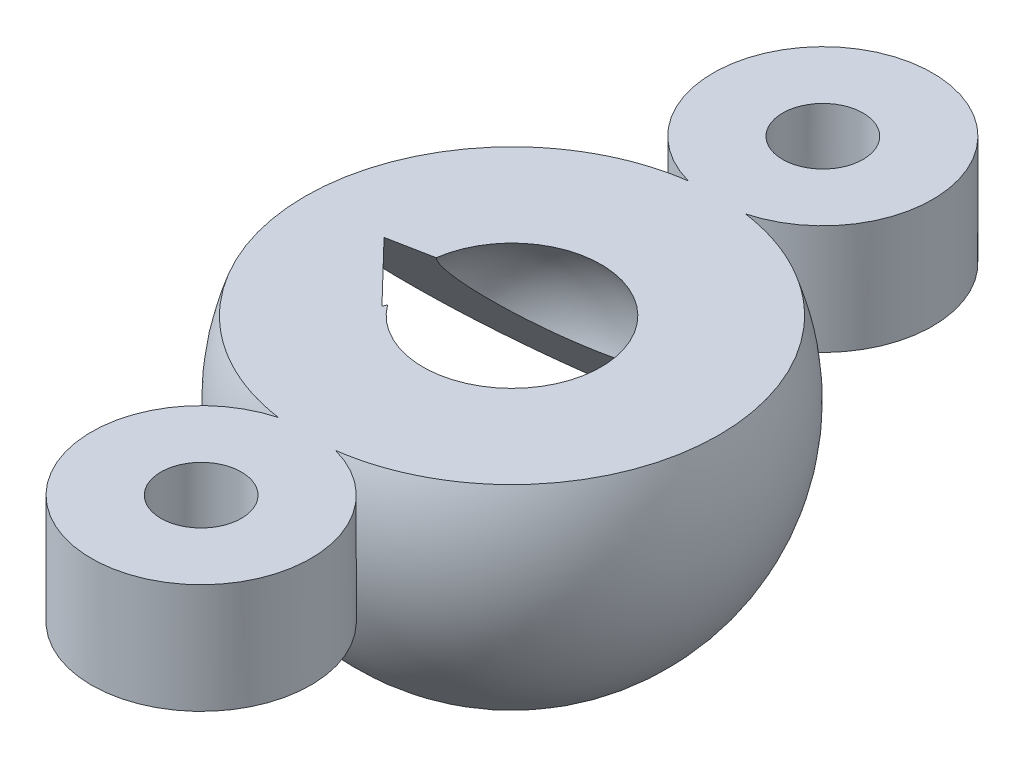
ISO-10303-21;
HEADER;
FILE_DESCRIPTION(('STEP AP214'),'2;1');
FILE_NAME('part.step','',(''),(''),'','','');
FILE_SCHEMA(('AUTOMOTIVE_DESIGN { 1 0 10303 214 1 1 1 1 }'));
ENDSEC;
DATA;
#1=APPLICATION_CONTEXT('core data for automotive mechanical design processes');
#2=APPLICATION_PROTOCOL_DEFINITION('international standard','automotive_design',2000,#1);
#3=PRODUCT_CONTEXT('',#1,'mechanical');
#4=PRODUCT('Part','Part','',(#3));
#5=PRODUCT_RELATED_PRODUCT_CATEGORY('part','',(#4));
#6=PRODUCT_DEFINITION_FORMATION('','',#4);
#7=PRODUCT_DEFINITION_CONTEXT('part definition',#1,'design');
#8=PRODUCT_DEFINITION('design','',#6,#7);
#9=PRODUCT_DEFINITION_SHAPE('','',#8);
#10=(LENGTH_UNIT() NAMED_UNIT(*) SI_UNIT(.MILLI.,.METRE.));
#11=(NAMED_UNIT(*) PLANE_ANGLE_UNIT() SI_UNIT($,.RADIAN.));
#12=(NAMED_UNIT(*) SI_UNIT($,.STERADIAN.) SOLID_ANGLE_UNIT());
#13=UNCERTAINTY_MEASURE_WITH_UNIT(LENGTH_MEASURE(1.E-05),#10,'distance_accuracy_value','');
#14=(GEOMETRIC_REPRESENTATION_CONTEXT(3) GLOBAL_UNCERTAINTY_ASSIGNED_CONTEXT((#13)) GLOBAL_UNIT_ASSIGNED_CONTEXT((#10,
#11,#12)) REPRESENTATION_CONTEXT('',''));
#15=CARTESIAN_POINT('',(0.,0.,0.));
#16=DIRECTION('',(0.,0.,1.));
#17=DIRECTION('',(1.,0.,0.));
#18=AXIS2_PLACEMENT_3D('',#15,#16,#17);
#19=CARTESIAN_POINT('',(-26.2916512459885,-73.,0.));
#20=DIRECTION('',(0.,0.,-1.));
#21=DIRECTION('',(-1.,0.,0.));
#22=AXIS2_PLACEMENT_3D('',#19,#20,#21);
#23=SPHERICAL_SURFACE('',#22,6.);
#24=CARTESIAN_POINT('',(-26.2916512459885,-71.,0.));
#25=DIRECTION('',(0.,1.,0.));
#26=DIRECTION('',(0.,0.,1.));
#27=AXIS2_PLACEMENT_3D('',#24,#25,#26);
#28=CIRCLE('',#27,5.65685424949238);
#29=CARTESIAN_POINT('',(-25.5125170001679,-71.,-5.60294117647059));
#30=VERTEX_POINT('',#29);
#31=CARTESIAN_POINT('',(-25.5125170001679,-71.,5.60294117647059));
#32=VERTEX_POINT('',#31);
#33=EDGE_CURVE('E241',#30,#32,#28,.F.);
#34=ORIENTED_EDGE('',*,*,#33,.T.);
#35=CARTESIAN_POINT('',(-25.512692009056,-70.9998,5.60289411529412));
#36=CARTESIAN_POINT('',(-25.4881300650007,-71.0278724460279,5.60950105457931));
#37=CARTESIAN_POINT('',(-25.4645799480684,-71.0567865660779,5.61616491159099));
#38=CARTESIAN_POINT('',(-25.4194041658645,-71.1160434934821,5.62950480182121));
#39=CARTESIAN_POINT('',(-25.3977769695417,-71.1463851342512,5.63618082095439));
#40=CARTESIAN_POINT('',(-25.3357390662621,-71.238994388675,5.65603840498483));
#41=CARTESIAN_POINT('',(-25.2979793181203,-71.303072510316,5.66910337854202));
#42=CARTESIAN_POINT('',(-25.229123634781,-71.4339893832936,5.69422706830234));
#43=CARTESIAN_POINT('',(-25.1979643450552,-71.5007937830541,5.70629460260237));
#44=CARTESIAN_POINT('',(-25.1411154943275,-71.6369688871939,5.72922297039156));
#45=CARTESIAN_POINT('',(-25.1154326977698,-71.7063426425279,5.74008230371415));
#46=CARTESIAN_POINT('',(-25.0618534813116,-71.8687142272823,5.76345066197582));
#47=CARTESIAN_POINT('',(-25.0357348493299,-71.9623745047603,5.77542903147855));
#48=CARTESIAN_POINT('',(-24.9911039620327,-72.1518627703867,5.79645035012798));
#49=CARTESIAN_POINT('',(-24.9725980638522,-72.2476925000107,5.80549084463764));
#50=CARTESIAN_POINT('',(-24.9425054025653,-72.4413341169983,5.82043119119931));
#51=CARTESIAN_POINT('',(-24.9309664449169,-72.5391550423461,5.82630931453206));
#52=CARTESIAN_POINT('',(-24.9146337564057,-72.7354433347071,5.83468458220686));
#53=CARTESIAN_POINT('',(-24.9098363815657,-72.8339103235676,5.83718355302931));
#54=CARTESIAN_POINT('',(-24.9069455687282,-73.0229211548644,5.83868607168889));
#55=CARTESIAN_POINT('',(-24.9083367836104,-73.1134555342483,5.83795833659046));
#56=CARTESIAN_POINT('',(-24.916709654596,-73.2941775183516,5.83362505478977));
#57=CARTESIAN_POINT('',(-24.9236899862422,-73.3843652001411,5.83002018988385));
#58=CARTESIAN_POINT('',(-24.9433049941966,-73.5629332316181,5.82005707797701));
#59=CARTESIAN_POINT('',(-24.955874113767,-73.6513224558663,5.81373078071612));
#60=CARTESIAN_POINT('',(-24.9870347069322,-73.8268475917443,5.79847549481539));
#61=CARTESIAN_POINT('',(-25.0056292770649,-73.9139828348421,5.78954516817626));
#62=CARTESIAN_POINT('',(-25.0274235715006,-74.0002,5.77938823294117));
#63=B_SPLINE_CURVE_WITH_KNOTS('',3,(#35,#36,#37,#38,#39,#40,#41,#42,#43,#44,#45,#46,#47,#48,#49,
#50,#51,#52,#53,#54,#55,#56,#57,#58,#59,#60,#61,#62),.UNSPECIFIED.,.F.,.F.,(4,2,2,2,2,2,2,2,2,2,
2,2,2,4),(0.,0.113585797209034,0.227080330731854,0.453169231822953,0.676978393535298,
0.901062418299851,1.19454534747401,1.48827285917147,1.78399360635949,2.07955444826479,
2.35098507155556,2.62235139274868,2.89061526718664,3.15901722427241),.UNSPECIFIED.);
#64=CARTESIAN_POINT('',(-25.0273729324914,-74.,5.77941176470588));
#65=VERTEX_POINT('',#64);
#66=EDGE_CURVE('E199',#32,#65,#63,.T.);
#67=ORIENTED_EDGE('',*,*,#66,.T.);
#68=CARTESIAN_POINT('',(-26.2916512459885,-74.,0.));
#69=DIRECTION('',(0.,-1.,0.));
#70=DIRECTION('',(0.,0.,-1.));
#71=AXIS2_PLACEMENT_3D('',#68,#69,#70);
#72=CIRCLE('',#71,5.91607978309961);
#73=CARTESIAN_POINT('',(-27.5559295594857,-74.,5.77941176470588));
#74=VERTEX_POINT('',#73);
#75=EDGE_CURVE('E246',#74,#65,#72,.F.);
#76=ORIENTED_EDGE('',*,*,#75,.F.);
#77=CARTESIAN_POINT('',(-27.5558789204764,-74.0002,5.77938823294117));
#78=CARTESIAN_POINT('',(-27.5686720218173,-73.9496620404665,5.78533603706417));
#79=CARTESIAN_POINT('',(-27.5803493209923,-73.8988041487702,5.79086867899217));
#80=CARTESIAN_POINT('',(-27.6015697054814,-73.7965686087353,5.80106400383362));
#81=CARTESIAN_POINT('',(-27.6111132167292,-73.7451910662703,5.80572686033751));
#82=CARTESIAN_POINT('',(-27.6366863405981,-73.5904873630535,5.81834985115131));
#83=CARTESIAN_POINT('',(-27.6496728986549,-73.4865322631475,5.82495127439358));
#84=CARTESIAN_POINT('',(-27.6681832151123,-73.2757451332539,5.83442924526646));
#85=CARTESIAN_POINT('',(-27.6735549053866,-73.1688967733631,5.83722984539448));
#86=CARTESIAN_POINT('',(-27.676555124043,-72.9550449188531,5.83878893274145));
#87=CARTESIAN_POINT('',(-27.674182588232,-72.8480414049326,5.83754686442657));
#88=CARTESIAN_POINT('',(-27.661616303271,-72.6348501805666,5.83105898688946));
#89=CARTESIAN_POINT('',(-27.6514399142857,-72.52866118703,5.82582206460827));
#90=CARTESIAN_POINT('',(-27.6229042752232,-72.3176550384306,5.81150186953819));
#91=CARTESIAN_POINT('',(-27.6045464824233,-72.2128376424789,5.80241928175627));
#92=CARTESIAN_POINT('',(-27.5591687490317,-72.0065978326292,5.78080399137251));
#93=CARTESIAN_POINT('',(-27.5322421988807,-71.9051512731432,5.76830868290863));
#94=CARTESIAN_POINT('',(-27.468626396254,-71.7058549967528,5.74030040521022));
#95=CARTESIAN_POINT('',(-27.4319457780831,-71.6080021854262,5.72479010809538));
#96=CARTESIAN_POINT('',(-27.3485901487389,-71.4206435124871,5.69200590870795));
#97=CARTESIAN_POINT('',(-27.3022726465904,-71.3309707282417,5.6748043528184));
#98=CARTESIAN_POINT('',(-27.2232683117044,-71.2020077467897,5.64818243977232));
#99=CARTESIAN_POINT('',(-27.1952182950292,-71.1597920463394,5.63913526501787));
#100=CARTESIAN_POINT('',(-27.1356124751682,-71.0778030739369,5.62099148786998));
#101=CARTESIAN_POINT('',(-27.1040499036828,-71.0380347549416,5.61189482333462));
#102=CARTESIAN_POINT('',(-27.0706104829247,-70.9997999999984,5.60289411529386));
#103=B_SPLINE_CURVE_WITH_KNOTS('',3,(#77,#78,#79,#80,#81,#82,#83,#84,#85,#86,#87,#88,#89,#90,
#91,#92,#93,#94,#95,#96,#97,#98,#99,#100,#101,#102),.UNSPECIFIED.,.F.,.F.,(4,2,2,2,2,2,2,2,2,2,
2,2,4),(0.,0.157377048485897,0.314722654217878,0.629234458382304,0.949942579700638,
1.27069477382298,1.59073549691188,1.91071923689571,2.2273285093036,2.54365844666375,
2.84986255835421,3.00416307873593,3.15876624238536),.UNSPECIFIED.);
#104=CARTESIAN_POINT('',(-27.0707854918091,-71.,5.60294117647059));
#105=VERTEX_POINT('',#104);
#106=EDGE_CURVE('E188',#74,#105,#103,.T.);
#107=ORIENTED_EDGE('',*,*,#106,.T.);
#108=CARTESIAN_POINT('',(-27.0707854918091,-71.,-5.60294117647059));
#109=VERTEX_POINT('',#108);
#110=EDGE_CURVE('E239',#105,#109,#28,.F.);
#111=ORIENTED_EDGE('',*,*,#110,.T.);
#112=CARTESIAN_POINT('',(-27.0706104829211,-70.9998,-5.60289411529412));
#113=CARTESIAN_POINT('',(-27.0951724269763,-71.0278724460279,-5.60950105457931));
#114=CARTESIAN_POINT('',(-27.1187225439086,-71.0567865660779,-5.61616491159099));
#115=CARTESIAN_POINT('',(-27.1638983261125,-71.1160434934821,-5.62950480182121));
#116=CARTESIAN_POINT('',(-27.1855255224353,-71.1463851342512,-5.63618082095439));
#117=CARTESIAN_POINT('',(-27.2475634257149,-71.238994388675,-5.65603840498483));
#118=CARTESIAN_POINT('',(-27.2853231738568,-71.303072510316,-5.66910337854202));
#119=CARTESIAN_POINT('',(-27.354178857196,-71.4339893832936,-5.69422706830234));
#120=CARTESIAN_POINT('',(-27.3853381469219,-71.5007937830541,-5.70629460260237));
#121=CARTESIAN_POINT('',(-27.4421869976495,-71.6369688871939,-5.72922297039156));
#122=CARTESIAN_POINT('',(-27.4678697942072,-71.7063426425279,-5.74008230371415));
#123=CARTESIAN_POINT('',(-27.5214490106654,-71.8687142272823,-5.76345066197582));
#124=CARTESIAN_POINT('',(-27.5475676426472,-71.9623745047603,-5.77542903147855));
#125=CARTESIAN_POINT('',(-27.5921985299443,-72.1518627703867,-5.79645035012798));
#126=CARTESIAN_POINT('',(-27.6107044281248,-72.2476925000107,-5.80549084463764));
#127=CARTESIAN_POINT('',(-27.6407970894118,-72.4413341169983,-5.82043119119931));
#128=CARTESIAN_POINT('',(-27.6523360470602,-72.5391550423461,-5.82630931453206));
#129=CARTESIAN_POINT('',(-27.6686687355714,-72.7354433347071,-5.83468458220686));
#130=CARTESIAN_POINT('',(-27.6734661104114,-72.8339103235676,-5.83718355302931));
#131=CARTESIAN_POINT('',(-27.6763569232488,-73.0229211548644,-5.83868607168889));
#132=CARTESIAN_POINT('',(-27.6749657083667,-73.1134555342483,-5.83795833659046));
#133=CARTESIAN_POINT('',(-27.666592837381,-73.2941775183516,-5.83362505478977));
#134=CARTESIAN_POINT('',(-27.6596125057349,-73.3843652001411,-5.83002018988385));
#135=CARTESIAN_POINT('',(-27.6399974977805,-73.5629332316181,-5.82005707797701));
#136=CARTESIAN_POINT('',(-27.6274283782101,-73.6513224558663,-5.81373078071612));
#137=CARTESIAN_POINT('',(-27.5962677850448,-73.8268475917443,-5.79847549481539));
#138=CARTESIAN_POINT('',(-27.5776732149121,-73.9139828348421,-5.78954516817626));
#139=CARTESIAN_POINT('',(-27.5558789204764,-74.0002,-5.77938823294117));
#140=B_SPLINE_CURVE_WITH_KNOTS('',3,(#112,#113,#114,#115,#116,#117,#118,#119,#120,#121,#122,
#123,#124,#125,#126,#127,#128,#129,#130,#131,#132,#133,#134,#135,#136,#137,#138,#139),
.UNSPECIFIED.,.F.,.F.,(4,2,2,2,2,2,2,2,2,2,2,2,2,4),(0.,0.113585797209034,0.227080330731854,
0.453169231822953,0.676978393535298,0.901062418299851,1.19454534747401,1.48827285917147,
1.78399360635949,2.07955444826479,2.35098507155556,2.62235139274868,2.89061526718664,
3.15901722427241),.UNSPECIFIED.);
#141=CARTESIAN_POINT('',(-27.5559295594857,-74.,-5.77941176470588));
#142=VERTEX_POINT('',#141);
#143=EDGE_CURVE('E234',#109,#142,#140,.T.);
#144=ORIENTED_EDGE('',*,*,#143,.T.);
#145=CARTESIAN_POINT('',(-26.2916512459885,-74.,0.));
#146=DIRECTION('',(0.,-1.,0.));
#147=DIRECTION('',(0.,0.,-1.));
#148=AXIS2_PLACEMENT_3D('',#145,#146,#147);
#149=CIRCLE('',#148,5.91607978309961);
#150=CARTESIAN_POINT('',(-25.0273729324914,-74.,-5.77941176470588));
#151=VERTEX_POINT('',#150);
#152=EDGE_CURVE('E243',#151,#142,#149,.F.);
#153=ORIENTED_EDGE('',*,*,#152,.F.);
#154=CARTESIAN_POINT('',(-25.0274235715006,-74.0002,-5.77938823294117));
#155=CARTESIAN_POINT('',(-25.0146304701598,-73.9496620404665,-5.78533603706417));
#156=CARTESIAN_POINT('',(-25.0029531709847,-73.8988041487702,-5.79086867899217));
#157=CARTESIAN_POINT('',(-24.9817327864956,-73.7965686087353,-5.80106400383362));
#158=CARTESIAN_POINT('',(-24.9721892752478,-73.7451910662703,-5.80572686033751));
#159=CARTESIAN_POINT('',(-24.946616151379,-73.5904873630535,-5.81834985115131));
#160=CARTESIAN_POINT('',(-24.9336295933221,-73.4865322631475,-5.82495127439358));
#161=CARTESIAN_POINT('',(-24.9151192768648,-73.2757451332539,-5.83442924526646));
#162=CARTESIAN_POINT('',(-24.9097475865905,-73.1688967733631,-5.83722984539448));
#163=CARTESIAN_POINT('',(-24.906747367934,-72.9550449188531,-5.83878893274145));
#164=CARTESIAN_POINT('',(-24.909119903745,-72.8480414049326,-5.83754686442657));
#165=CARTESIAN_POINT('',(-24.921686188706,-72.6348501805666,-5.83105898688946));
#166=CARTESIAN_POINT('',(-24.9318625776913,-72.52866118703,-5.82582206460827));
#167=CARTESIAN_POINT('',(-24.9603982167538,-72.3176550384306,-5.81150186953819));
#168=CARTESIAN_POINT('',(-24.9787560095538,-72.2128376424789,-5.80241928175627));
#169=CARTESIAN_POINT('',(-25.0241337429453,-72.0065978326292,-5.78080399137251));
#170=CARTESIAN_POINT('',(-25.0510602930963,-71.9051512731432,-5.76830868290863));
#171=CARTESIAN_POINT('',(-25.114676095723,-71.7058549967528,-5.74030040521022));
#172=CARTESIAN_POINT('',(-25.151356713894,-71.6080021854262,-5.72479010809538));
#173=CARTESIAN_POINT('',(-25.2347123432382,-71.4206435124871,-5.69200590870795));
#174=CARTESIAN_POINT('',(-25.2810298453866,-71.3309707282417,-5.6748043528184));
#175=CARTESIAN_POINT('',(-25.3600341802726,-71.2020077467897,-5.64818243977232));
#176=CARTESIAN_POINT('',(-25.3880841969479,-71.1597920463394,-5.63913526501787));
#177=CARTESIAN_POINT('',(-25.4476900168088,-71.0778030739369,-5.62099148786998));
#178=CARTESIAN_POINT('',(-25.4792525882942,-71.0380347549416,-5.61189482333462));
#179=CARTESIAN_POINT('',(-25.5126920090523,-70.9997999999984,-5.60289411529386));
#180=B_SPLINE_CURVE_WITH_KNOTS('',3,(#154,#155,#156,#157,#158,#159,#160,#161,#162,#163,#164,
#165,#166,#167,#168,#169,#170,#171,#172,#173,#174,#175,#176,#177,#178,#179),.UNSPECIFIED.,.F.,
.F.,(4,2,2,2,2,2,2,2,2,2,2,2,4),(0.,0.157377048485897,0.314722654217878,0.629234458382304,
0.949942579700638,1.27069477382298,1.59073549691188,1.91071923689571,2.2273285093036,
2.54365844666375,2.84986255835421,3.00416307873593,3.15876624238536),.UNSPECIFIED.);
#181=EDGE_CURVE('E227',#151,#30,#180,.T.);
#182=ORIENTED_EDGE('',*,*,#181,.T.);
#183=EDGE_LOOP('',(#34,#67,#76,#107,#111,#144,#153,#182));
#184=FACE_BOUND('',#183,.T.);
#185=CARTESIAN_POINT('',(-26.5685991890742,-71.7684504931306,-1.42006536784419));
#186=DIRECTION('',(0.145762075308234,-0.648183950983876,0.747402825181153));
#187=DIRECTION('',(0.,-0.755471507146539,-0.655181503012514));
#188=AXIS2_PLACEMENT_3D('',#185,#186,#187);
#189=CIRCLE('',#188,5.69122131005288);
#190=CARTESIAN_POINT('',(-28.3091391382539,-76.0254293010476,-4.77247526435969));
#191=VERTEX_POINT('',#190);
#192=CARTESIAN_POINT('',(-32.1881264123781,-72.5784404179814,-1.02658079611846));
#193=VERTEX_POINT('',#192);
#194=EDGE_CURVE('E135',#191,#193,#189,.F.);
#195=ORIENTED_EDGE('',*,*,#194,.T.);
#196=CARTESIAN_POINT('',(-28.2311448830506,-71.2765055584669,1.87294723412062));
#197=DIRECTION('',(0.606091761581906,-0.538592012979099,-0.585296010662693));
#198=DIRECTION('',(-0.694658370458998,0.,-0.71933980033865));
#199=AXIS2_PLACEMENT_3D('',#196,#197,#198);
#200=CIRCLE('',#199,5.07543101617981);
#201=CARTESIAN_POINT('',(-31.6342305262068,-75.0415394317201,1.81354993956992));
#202=VERTEX_POINT('',#201);
#203=EDGE_CURVE('E170',#193,#202,#200,.F.);
#204=ORIENTED_EDGE('',*,*,#203,.T.);
#205=CARTESIAN_POINT('',(-26.0147033029029,-74.2315495068694,1.4200653678442));
#206=DIRECTION('',(-0.145762075308233,0.648183950983876,-0.747402825181153));
#207=DIRECTION('',(0.,0.755471507146539,0.655181503012514));
#208=AXIS2_PLACEMENT_3D('',#205,#206,#207);
#209=CIRCLE('',#208,5.69122131005288);
#210=CARTESIAN_POINT('',(-27.7552432520826,-78.4885283147863,-1.9323445286713));
#211=VERTEX_POINT('',#210);
#212=EDGE_CURVE('E157',#202,#211,#209,.F.);
#213=ORIENTED_EDGE('',*,*,#212,.T.);
#214=CARTESIAN_POINT('',(-24.3521576089264,-74.7234944415331,-1.87294723412062));
#215=DIRECTION('',(-0.606091761581906,0.538592012979099,0.585296010662693));
#216=DIRECTION('',(0.694658370458998,0.,0.71933980033865));
#217=AXIS2_PLACEMENT_3D('',#214,#215,#216);
#218=CIRCLE('',#217,5.07543101617981);
#219=EDGE_CURVE('E11',#211,#191,#218,.F.);
#220=ORIENTED_EDGE('',*,*,#219,.T.);
#221=EDGE_LOOP('',(#195,#204,#213,#220));
#222=FACE_BOUND('',#221,.T.);
#223=ADVANCED_FACE('F41',(#184,#222),#23,.T.);
#224=CARTESIAN_POINT('',(-33.2916512459885,-71.,7.));
#225=DIRECTION('',(0.,1.,0.));
#226=DIRECTION('',(0.,0.,1.));
#227=AXIS2_PLACEMENT_3D('',#224,#225,#226);
#228=PLANE('',#227);
#229=CARTESIAN_POINT('',(-26.2916512459885,-71.,8.5));
#230=DIRECTION('',(0.,1.,0.));
#231=DIRECTION('',(0.,0.,1.));
#232=AXIS2_PLACEMENT_3D('',#229,#230,#231);
#233=CIRCLE('',#232,1.1);
#234=CARTESIAN_POINT('',(-26.2916512459885,-71.,9.6));
#235=VERTEX_POINT('',#234);
#236=EDGE_CURVE('E172',#235,#235,#233,.F.);
#237=ORIENTED_EDGE('',*,*,#236,.T.);
#238=EDGE_LOOP('',(#237));
#239=FACE_BOUND('',#238,.T.);
#240=CARTESIAN_POINT('',(-26.2916512459885,-71.,-8.5));
#241=DIRECTION('',(0.,1.,0.));
#242=DIRECTION('',(0.,0.,1.));
#243=AXIS2_PLACEMENT_3D('',#240,#241,#242);
#244=CIRCLE('',#243,1.1);
#245=CARTESIAN_POINT('',(-26.2916512459885,-71.,-7.4));
#246=VERTEX_POINT('',#245);
#247=EDGE_CURVE('E185',#246,#246,#244,.F.);
#248=ORIENTED_EDGE('',*,*,#247,.T.);
#249=EDGE_LOOP('',(#248));
#250=FACE_BOUND('',#249,.T.);
#251=ORIENTED_EDGE('',*,*,#110,.F.);
#252=CARTESIAN_POINT('',(-26.2916512459885,-71.,8.5));
#253=DIRECTION('',(0.,-1.,0.));
#254=DIRECTION('',(0.,0.,-1.));
#255=AXIS2_PLACEMENT_3D('',#252,#253,#254);
#256=CIRCLE('',#255,3.);
#257=EDGE_CURVE('E194',#32,#105,#256,.T.);
#258=ORIENTED_EDGE('',*,*,#257,.F.);
#259=ORIENTED_EDGE('',*,*,#33,.F.);
#260=CARTESIAN_POINT('',(-26.2916512459885,-71.,-8.5));
#261=DIRECTION('',(0.,-1.,0.));
#262=DIRECTION('',(0.,0.,-1.));
#263=AXIS2_PLACEMENT_3D('',#260,#261,#262);
#264=CIRCLE('',#263,3.);
#265=EDGE_CURVE('E295',#109,#30,#264,.T.);
#266=ORIENTED_EDGE('',*,*,#265,.F.);
#267=EDGE_LOOP('',(#251,#258,#259,#266));
#268=FACE_BOUND('',#267,.T.);
#269=DIRECTION('',(-0.694658370458998,0.,-0.71933980033865));
#270=VECTOR('',#269,1.);
#271=CARTESIAN_POINT('',(-27.9839854222577,-71.,1.87444669359595));
#272=LINE('',#271,#270);
#273=CARTESIAN_POINT('',(-28.2933247996857,-71.,1.55411639102008));
#274=VERTEX_POINT('',#273);
#275=CARTESIAN_POINT('',(-29.8953497806659,-71.,-0.104829040234692));
#276=VERTEX_POINT('',#275);
#277=EDGE_CURVE('E47',#274,#276,#272,.T.);
#278=ORIENTED_EDGE('',*,*,#277,.T.);
#279=DIRECTION('',(0.981508513902753,0.,-0.191418486924357));
#280=VECTOR('',#279,1.);
#281=CARTESIAN_POINT('',(-34.502054522422,-71.,0.793592561701173));
#282=LINE('',#281,#280);
#283=CARTESIAN_POINT('',(-28.7017378621309,-71.,-0.337612948050584));
#284=VERTEX_POINT('',#283);
#285=EDGE_CURVE('E161',#276,#284,#282,.T.);
#286=ORIENTED_EDGE('',*,*,#285,.T.);
#287=CARTESIAN_POINT('',(-26.2916512459885,-71.,0.));
#288=DIRECTION('',(0.,1.,0.));
#289=DIRECTION('',(0.,0.,1.));
#290=AXIS2_PLACEMENT_3D('',#287,#288,#289);
#291=CIRCLE('',#290,2.4336187047276);
#292=CARTESIAN_POINT('',(-28.2495897548034,-71.,1.44532930354986));
#293=VERTEX_POINT('',#292);
#294=EDGE_CURVE('E184',#293,#284,#291,.T.);
#295=ORIENTED_EDGE('',*,*,#294,.F.);
#296=DIRECTION('',(-0.373009193509687,0.,0.927827646471721));
#297=VECTOR('',#296,1.);
#298=CARTESIAN_POINT('',(-30.873527525626,-71.,7.97214432246016));
#299=LINE('',#298,#297);
#300=EDGE_CURVE('E63',#293,#274,#299,.T.);
#301=ORIENTED_EDGE('',*,*,#300,.T.);
#302=EDGE_LOOP('',(#278,#286,#295,#301));
#303=FACE_BOUND('',#302,.T.);
#304=ADVANCED_FACE('F224',(#239,#250,#268,#303),#228,.T.);
#305=CARTESIAN_POINT('',(-26.2916512459885,-73.,0.));
#306=DIRECTION('',(0.,0.,-1.));
#307=DIRECTION('',(-1.,0.,0.));
#308=AXIS2_PLACEMENT_3D('',#305,#306,#307);
#309=SPHERICAL_SURFACE('',#308,3.15);
#310=CARTESIAN_POINT('',(-26.5685991890742,-71.7684504931306,-1.42006536784419));
#311=DIRECTION('',(0.145762075308234,-0.648183950983876,0.747402825181153));
#312=DIRECTION('',(0.,-0.755471507146539,-0.655181503012514));
#313=AXIS2_PLACEMENT_3D('',#310,#311,#312);
#314=CIRCLE('',#313,2.51246890528022);
#315=CARTESIAN_POINT('',(-25.0458124843531,-73.1216461783729,-2.89060339501876));
#316=VERTEX_POINT('',#315);
#317=EDGE_CURVE('E263',#316,#284,#314,.F.);
#318=ORIENTED_EDGE('',*,*,#317,.F.);
#319=CARTESIAN_POINT('',(-26.2916512459885,-73.,0.));
#320=DIRECTION('',(-0.781924672807029,-0.538308656109162,-0.314352663124665));
#321=DIRECTION('',(0.567054775108053,-0.823680084758127,0.));
#322=AXIS2_PLACEMENT_3D('',#319,#320,#321);
#323=CIRCLE('',#322,3.15);
#324=CARTESIAN_POINT('',(-24.4919165981818,-75.5847451921116,-0.0504726593303733));
#325=VERTEX_POINT('',#324);
#326=EDGE_CURVE('E141',#325,#316,#323,.F.);
#327=ORIENTED_EDGE('',*,*,#326,.F.);
#328=CARTESIAN_POINT('',(-26.0147033029029,-74.2315495068694,1.4200653678442));
#329=DIRECTION('',(-0.145762075308233,0.648183950983876,-0.747402825181153));
#330=DIRECTION('',(0.,0.755471507146539,0.655181503012514));
#331=AXIS2_PLACEMENT_3D('',#328,#329,#330);
#332=CIRCLE('',#331,2.51246890528022);
#333=CARTESIAN_POINT('',(-27.5374900076239,-72.8783538216271,2.89060339501877));
#334=VERTEX_POINT('',#333);
#335=EDGE_CURVE('E261',#334,#325,#332,.F.);
#336=ORIENTED_EDGE('',*,*,#335,.F.);
#337=EDGE_CURVE('E248',#293,#334,#323,.F.);
#338=ORIENTED_EDGE('',*,*,#337,.F.);
#339=ORIENTED_EDGE('',*,*,#294,.T.);
#340=EDGE_LOOP('',(#318,#327,#336,#338,#339));
#341=FACE_BOUND('',#340,.T.);
#342=ADVANCED_FACE('F279',(#341),#309,.F.);
#343=CARTESIAN_POINT('',(-26.2916512459885,-74.25,8.5));
#344=DIRECTION('',(0.,1.,0.));
#345=DIRECTION('',(0.,0.,1.));
#346=AXIS2_PLACEMENT_3D('',#343,#344,#345);
#347=CYLINDRICAL_SURFACE('',#346,1.1);
#348=ORIENTED_EDGE('',*,*,#236,.F.);
#349=EDGE_LOOP('',(#348));
#350=FACE_BOUND('',#349,.T.);
#351=CARTESIAN_POINT('',(-26.2916512459885,-72.8,8.5));
#352=DIRECTION('',(0.,-1.,0.));
#353=DIRECTION('',(0.,0.,-1.));
#354=AXIS2_PLACEMENT_3D('',#351,#352,#353);
#355=CIRCLE('',#354,1.1);
#356=CARTESIAN_POINT('',(-26.2916512459885,-72.8,7.4));
#357=VERTEX_POINT('',#356);
#358=EDGE_CURVE('E173',#357,#357,#355,.T.);
#359=ORIENTED_EDGE('',*,*,#358,.T.);
#360=EDGE_LOOP('',(#359));
#361=FACE_BOUND('',#360,.T.);
#362=ADVANCED_FACE('F333',(#350,#361),#347,.F.);
#363=CARTESIAN_POINT('',(-26.2916512459885,-74.25,-8.5));
#364=DIRECTION('',(0.,1.,0.));
#365=DIRECTION('',(0.,0.,1.));
#366=AXIS2_PLACEMENT_3D('',#363,#364,#365);
#367=CYLINDRICAL_SURFACE('',#366,1.1);
#368=ORIENTED_EDGE('',*,*,#247,.F.);
#369=EDGE_LOOP('',(#368));
#370=FACE_BOUND('',#369,.T.);
#371=CARTESIAN_POINT('',(-26.2916512459885,-72.8,-8.5));
#372=DIRECTION('',(0.,-1.,0.));
#373=DIRECTION('',(0.,0.,-1.));
#374=AXIS2_PLACEMENT_3D('',#371,#372,#373);
#375=CIRCLE('',#374,1.1);
#376=CARTESIAN_POINT('',(-26.2916512459885,-72.8,-9.6));
#377=VERTEX_POINT('',#376);
#378=EDGE_CURVE('E181',#377,#377,#375,.T.);
#379=ORIENTED_EDGE('',*,*,#378,.T.);
#380=EDGE_LOOP('',(#379));
#381=FACE_BOUND('',#380,.T.);
#382=ADVANCED_FACE('F225',(#370,#381),#367,.F.);
#383=CARTESIAN_POINT('',(-26.2916512459885,-74.,-8.5));
#384=DIRECTION('',(0.,1.,0.));
#385=DIRECTION('',(0.,0.,1.));
#386=AXIS2_PLACEMENT_3D('',#383,#384,#385);
#387=CYLINDRICAL_SURFACE('',#386,3.);
#388=ORIENTED_EDGE('',*,*,#143,.F.);
#389=ORIENTED_EDGE('',*,*,#265,.T.);
#390=ORIENTED_EDGE('',*,*,#181,.F.);
#391=CARTESIAN_POINT('',(-26.2916512459885,-74.,-8.5));
#392=DIRECTION('',(0.,-1.,0.));
#393=DIRECTION('',(0.,0.,-1.));
#394=AXIS2_PLACEMENT_3D('',#391,#392,#393);
#395=CIRCLE('',#394,3.);
#396=EDGE_CURVE('E299',#142,#151,#395,.T.);
#397=ORIENTED_EDGE('',*,*,#396,.F.);
#398=EDGE_LOOP('',(#388,#389,#390,#397));
#399=FACE_BOUND('',#398,.T.);
#400=ADVANCED_FACE('F218',(#399),#387,.T.);
#401=CARTESIAN_POINT('',(-26.2916512459885,-74.,-8.5));
#402=DIRECTION('',(0.,-1.,0.));
#403=DIRECTION('',(0.,0.,-1.));
#404=AXIS2_PLACEMENT_3D('',#401,#402,#403);
#405=PLANE('',#404);
#406=CARTESIAN_POINT('',(-26.2916512459885,-74.,-8.5));
#407=DIRECTION('',(0.,-1.,0.));
#408=DIRECTION('',(0.,0.,-1.));
#409=AXIS2_PLACEMENT_3D('',#406,#407,#408);
#410=CIRCLE('',#409,2.1);
#411=CARTESIAN_POINT('',(-26.2916512459885,-74.,-10.6));
#412=VERTEX_POINT('',#411);
#413=EDGE_CURVE('E187',#412,#412,#410,.F.);
#414=ORIENTED_EDGE('',*,*,#413,.T.);
#415=EDGE_LOOP('',(#414));
#416=FACE_BOUND('',#415,.T.);
#417=ORIENTED_EDGE('',*,*,#396,.T.);
#418=ORIENTED_EDGE('',*,*,#152,.T.);
#419=EDGE_LOOP('',(#417,#418));
#420=FACE_BOUND('',#419,.T.);
#421=ADVANCED_FACE('F211',(#416,#420),#405,.T.);
#422=CARTESIAN_POINT('',(-26.2916512459885,-74.,8.5));
#423=DIRECTION('',(0.,1.,0.));
#424=DIRECTION('',(0.,0.,1.));
#425=AXIS2_PLACEMENT_3D('',#422,#423,#424);
#426=CYLINDRICAL_SURFACE('',#425,3.);
#427=ORIENTED_EDGE('',*,*,#66,.F.);
#428=ORIENTED_EDGE('',*,*,#257,.T.);
#429=ORIENTED_EDGE('',*,*,#106,.F.);
#430=CARTESIAN_POINT('',(-26.2916512459885,-74.,8.5));
#431=DIRECTION('',(0.,-1.,0.));
#432=DIRECTION('',(0.,0.,-1.));
#433=AXIS2_PLACEMENT_3D('',#430,#431,#432);
#434=CIRCLE('',#433,3.);
#435=EDGE_CURVE('E190',#65,#74,#434,.T.);
#436=ORIENTED_EDGE('',*,*,#435,.F.);
#437=EDGE_LOOP('',(#427,#428,#429,#436));
#438=FACE_BOUND('',#437,.T.);
#439=ADVANCED_FACE('F207',(#438),#426,.T.);
#440=CARTESIAN_POINT('',(-26.2916512459885,-74.,8.5));
#441=DIRECTION('',(0.,-1.,0.));
#442=DIRECTION('',(0.,0.,-1.));
#443=AXIS2_PLACEMENT_3D('',#440,#441,#442);
#444=PLANE('',#443);
#445=CARTESIAN_POINT('',(-26.2916512459885,-74.,8.5));
#446=DIRECTION('',(0.,-1.,0.));
#447=DIRECTION('',(0.,0.,-1.));
#448=AXIS2_PLACEMENT_3D('',#445,#446,#447);
#449=CIRCLE('',#448,2.1);
#450=CARTESIAN_POINT('',(-26.2916512459885,-74.,6.4));
#451=VERTEX_POINT('',#450);
#452=EDGE_CURVE('E178',#451,#451,#449,.F.);
#453=ORIENTED_EDGE('',*,*,#452,.T.);
#454=EDGE_LOOP('',(#453));
#455=FACE_BOUND('',#454,.T.);
#456=ORIENTED_EDGE('',*,*,#435,.T.);
#457=ORIENTED_EDGE('',*,*,#75,.T.);
#458=EDGE_LOOP('',(#456,#457));
#459=FACE_BOUND('',#458,.T.);
#460=ADVANCED_FACE('F214',(#455,#459),#444,.T.);
#461=CARTESIAN_POINT('',(-26.2916512459885,-74.25,-8.5));
#462=DIRECTION('',(0.,1.,0.));
#463=DIRECTION('',(0.,0.,1.));
#464=AXIS2_PLACEMENT_3D('',#461,#462,#463);
#465=CYLINDRICAL_SURFACE('',#464,2.1);
#466=ORIENTED_EDGE('',*,*,#413,.F.);
#467=EDGE_LOOP('',(#466));
#468=FACE_BOUND('',#467,.T.);
#469=CARTESIAN_POINT('',(-26.2916512459885,-72.8,-8.5));
#470=DIRECTION('',(0.,-1.,0.));
#471=DIRECTION('',(0.,0.,-1.));
#472=AXIS2_PLACEMENT_3D('',#469,#470,#471);
#473=CIRCLE('',#472,2.1);
#474=CARTESIAN_POINT('',(-26.2916512459885,-72.8,-10.6));
#475=VERTEX_POINT('',#474);
#476=EDGE_CURVE('E180',#475,#475,#473,.T.);
#477=ORIENTED_EDGE('',*,*,#476,.F.);
#478=EDGE_LOOP('',(#477));
#479=FACE_BOUND('',#478,.T.);
#480=ADVANCED_FACE('F303',(#468,#479),#465,.F.);
#481=CARTESIAN_POINT('',(-26.2916512459885,-72.8,-8.5));
#482=DIRECTION('',(0.,-1.,0.));
#483=DIRECTION('',(0.,0.,-1.));
#484=AXIS2_PLACEMENT_3D('',#481,#482,#483);
#485=PLANE('',#484);
#486=ORIENTED_EDGE('',*,*,#378,.F.);
#487=EDGE_LOOP('',(#486));
#488=FACE_BOUND('',#487,.T.);
#489=ORIENTED_EDGE('',*,*,#476,.T.);
#490=EDGE_LOOP('',(#489));
#491=FACE_BOUND('',#490,.T.);
#492=ADVANCED_FACE('F309',(#488,#491),#485,.T.);
#493=CARTESIAN_POINT('',(-26.2916512459885,-74.25,8.5));
#494=DIRECTION('',(0.,1.,0.));
#495=DIRECTION('',(0.,0.,1.));
#496=AXIS2_PLACEMENT_3D('',#493,#494,#495);
#497=CYLINDRICAL_SURFACE('',#496,2.1);
#498=ORIENTED_EDGE('',*,*,#452,.F.);
#499=EDGE_LOOP('',(#498));
#500=FACE_BOUND('',#499,.T.);
#501=CARTESIAN_POINT('',(-26.2916512459885,-72.8,8.5));
#502=DIRECTION('',(0.,-1.,0.));
#503=DIRECTION('',(0.,0.,-1.));
#504=AXIS2_PLACEMENT_3D('',#501,#502,#503);
#505=CIRCLE('',#504,2.1);
#506=CARTESIAN_POINT('',(-26.2916512459885,-72.8,6.4));
#507=VERTEX_POINT('',#506);
#508=EDGE_CURVE('E167',#507,#507,#505,.T.);
#509=ORIENTED_EDGE('',*,*,#508,.F.);
#510=EDGE_LOOP('',(#509));
#511=FACE_BOUND('',#510,.T.);
#512=ADVANCED_FACE('F314',(#500,#511),#497,.F.);
#513=CARTESIAN_POINT('',(-26.2916512459885,-72.8,8.5));
#514=DIRECTION('',(0.,-1.,0.));
#515=DIRECTION('',(0.,0.,-1.));
#516=AXIS2_PLACEMENT_3D('',#513,#514,#515);
#517=PLANE('',#516);
#518=ORIENTED_EDGE('',*,*,#358,.F.);
#519=EDGE_LOOP('',(#518));
#520=FACE_BOUND('',#519,.T.);
#521=ORIENTED_EDGE('',*,*,#508,.T.);
#522=EDGE_LOOP('',(#521));
#523=FACE_BOUND('',#522,.T.);
#524=ADVANCED_FACE('F320',(#520,#523),#517,.T.);
#525=CARTESIAN_POINT('',(-31.8944563939111,-81.3381305094941,-3.59640849752307));
#526=DIRECTION('',(-0.145762075308233,0.648183950983876,-0.747402825181153));
#527=DIRECTION('',(0.,0.755471507146539,0.655181503012514));
#528=AXIS2_PLACEMENT_3D('',#525,#526,#527);
#529=PLANE('',#528);
#530=DIRECTION('',(0.781924672807028,0.538308656109163,0.314352663124665));
#531=VECTOR('',#530,1.);
#532=CARTESIAN_POINT('',(-35.7734436680353,-77.8911416264279,0.149485970718159));
#533=LINE('',#532,#531);
#534=CARTESIAN_POINT('',(-27.954196939965,-72.5080550653363,3.29301260196481));
#535=VERTEX_POINT('',#534);
#536=EDGE_CURVE('E152',#202,#535,#533,.T.);
#537=ORIENTED_EDGE('',*,*,#536,.T.);
#538=DIRECTION('',(-0.606091761581907,0.538592012979101,0.585296010662692));
#539=VECTOR('',#538,1.);
#540=CARTESIAN_POINT('',(-24.0752096658408,-75.9550439484025,-0.452881866276421));
#541=LINE('',#540,#539);
#542=EDGE_CURVE('E146',#334,#535,#541,.T.);
#543=ORIENTED_EDGE('',*,*,#542,.F.);
#544=ORIENTED_EDGE('',*,*,#335,.T.);
#545=CARTESIAN_POINT('',(-24.0752096658408,-75.9550439484025,-0.452881866276421));
#546=VERTEX_POINT('',#545);
#547=EDGE_CURVE('E147',#546,#325,#541,.T.);
#548=ORIENTED_EDGE('',*,*,#547,.F.);
#549=DIRECTION('',(0.781924672807028,0.538308656109163,0.314352663124665));
#550=VECTOR('',#549,1.);
#551=CARTESIAN_POINT('',(-31.8944563939111,-81.3381305094941,-3.59640849752307));
#552=LINE('',#551,#550);
#553=EDGE_CURVE('E57',#211,#546,#552,.T.);
#554=ORIENTED_EDGE('',*,*,#553,.F.);
#555=ORIENTED_EDGE('',*,*,#212,.F.);
#556=EDGE_LOOP('',(#537,#543,#544,#548,#554,#555));
#557=FACE_BOUND('',#556,.T.);
#558=ADVANCED_FACE('F274',(#557),#529,.T.);
#559=CARTESIAN_POINT('',(-46.8018062660292,-32.2202615043522,-18.815460044195));
#560=DIRECTION('',(-0.781924672807029,-0.538308656109162,-0.314352663124665));
#561=DIRECTION('',(0.567054775108053,-0.823680084758127,0.));
#562=AXIS2_PLACEMENT_3D('',#559,#560,#561);
#563=PLANE('',#562);
#564=ORIENTED_EDGE('',*,*,#326,.T.);
#565=DIRECTION('',(0.606091761581906,-0.538592012979101,-0.585296010662692));
#566=VECTOR('',#565,1.);
#567=CARTESIAN_POINT('',(-28.5080928261363,-70.0449560515975,0.452881866276421));
#568=LINE('',#567,#566);
#569=CARTESIAN_POINT('',(-24.6291055520121,-73.4919449346637,-3.29301260196481));
#570=VERTEX_POINT('',#569);
#571=EDGE_CURVE('E130',#316,#570,#568,.T.);
#572=ORIENTED_EDGE('',*,*,#571,.T.);
#573=DIRECTION('',(0.145762075308235,-0.648183950983877,0.747402825181152));
#574=VECTOR('',#573,1.);
#575=CARTESIAN_POINT('',(-24.6291055520121,-73.4919449346637,-3.29301260196481));
#576=LINE('',#575,#574);
#577=EDGE_CURVE('E142',#570,#546,#576,.T.);
#578=ORIENTED_EDGE('',*,*,#577,.T.);
#579=ORIENTED_EDGE('',*,*,#547,.T.);
#580=EDGE_LOOP('',(#564,#572,#578,#579));
#581=FACE_BOUND('',#580,.T.);
#582=ADVANCED_FACE('F139',(#581),#563,.T.);
#583=CARTESIAN_POINT('',(-35.7734436680353,-77.8911416264279,0.149485970718159));
#584=DIRECTION('',(0.606091761581906,-0.538592012979099,-0.585296010662693));
#585=DIRECTION('',(-0.694658370458998,0.,-0.71933980033865));
#586=AXIS2_PLACEMENT_3D('',#583,#584,#585);
#587=PLANE('',#586);
#588=DIRECTION('',(0.781924672807028,0.538308656109163,0.314352663124665));
#589=VECTOR('',#588,1.);
#590=CARTESIAN_POINT('',(-36.3273395542066,-75.4280426126891,-2.69064476497023));
#591=LINE('',#590,#589);
#592=EDGE_CURVE('E134',#193,#276,#591,.T.);
#593=ORIENTED_EDGE('',*,*,#592,.T.);
#594=ORIENTED_EDGE('',*,*,#277,.F.);
#595=DIRECTION('',(-0.145762075308234,0.648183950983878,-0.747402825181152));
#596=VECTOR('',#595,1.);
#597=CARTESIAN_POINT('',(-27.954196939965,-72.5080550653363,3.29301260196481));
#598=LINE('',#597,#596);
#599=EDGE_CURVE('E144',#535,#274,#598,.T.);
#600=ORIENTED_EDGE('',*,*,#599,.F.);
#601=ORIENTED_EDGE('',*,*,#536,.F.);
#602=ORIENTED_EDGE('',*,*,#203,.F.);
#603=EDGE_LOOP('',(#593,#594,#600,#601,#602));
#604=FACE_BOUND('',#603,.T.);
#605=ADVANCED_FACE('F269',(#604),#587,.T.);
#606=CARTESIAN_POINT('',(-36.3273395542066,-75.4280426126891,-2.69064476497023));
#607=DIRECTION('',(0.145762075308234,-0.648183950983876,0.747402825181153));
#608=DIRECTION('',(0.,-0.755471507146539,-0.655181503012514));
#609=AXIS2_PLACEMENT_3D('',#606,#607,#608);
#610=PLANE('',#609);
#611=DIRECTION('',(0.781924672807028,0.538308656109163,0.314352663124665));
#612=VECTOR('',#611,1.);
#613=CARTESIAN_POINT('',(-32.4483522800824,-78.8750314957554,-6.43653923321146));
#614=LINE('',#613,#612);
#615=EDGE_CURVE('E123',#191,#570,#614,.T.);
#616=ORIENTED_EDGE('',*,*,#615,.T.);
#617=ORIENTED_EDGE('',*,*,#571,.F.);
#618=ORIENTED_EDGE('',*,*,#317,.T.);
#619=ORIENTED_EDGE('',*,*,#285,.F.);
#620=ORIENTED_EDGE('',*,*,#592,.F.);
#621=ORIENTED_EDGE('',*,*,#194,.F.);
#622=EDGE_LOOP('',(#616,#617,#618,#619,#620,#621));
#623=FACE_BOUND('',#622,.T.);
#624=ADVANCED_FACE('F126',(#623),#610,.T.);
#625=CARTESIAN_POINT('',(-32.4483522800824,-78.8750314957554,-6.43653923321146));
#626=DIRECTION('',(-0.606091761581906,0.538592012979099,0.585296010662693));
#627=DIRECTION('',(0.694658370458998,0.,0.71933980033865));
#628=AXIS2_PLACEMENT_3D('',#625,#626,#627);
#629=PLANE('',#628);
#630=ORIENTED_EDGE('',*,*,#553,.T.);
#631=ORIENTED_EDGE('',*,*,#577,.F.);
#632=ORIENTED_EDGE('',*,*,#615,.F.);
#633=ORIENTED_EDGE('',*,*,#219,.F.);
#634=EDGE_LOOP('',(#630,#631,#632,#633));
#635=FACE_BOUND('',#634,.T.);
#636=ADVANCED_FACE('F149',(#635),#629,.T.);
#637=ORIENTED_EDGE('',*,*,#337,.T.);
#638=ORIENTED_EDGE('',*,*,#542,.T.);
#639=ORIENTED_EDGE('',*,*,#599,.T.);
#640=ORIENTED_EDGE('',*,*,#300,.F.);
#641=EDGE_LOOP('',(#637,#638,#639,#640));
#642=FACE_BOUND('',#641,.T.);
#643=ADVANCED_FACE('F272',(#642),#563,.T.);
#644=CLOSED_SHELL('',(#223,#304,#342,#362,#382,#400,#421,#439,#460,#480,#492,#512,#524,#558,
#582,#605,#624,#636,#643));
#645=MANIFOLD_SOLID_BREP('B2',#644);
#646=ADVANCED_BREP_SHAPE_REPRESENTATION('',(#18,#645),#14);
#647=SHAPE_DEFINITION_REPRESENTATION(#9,#646);
ENDSEC;
END-ISO-10303-21;
